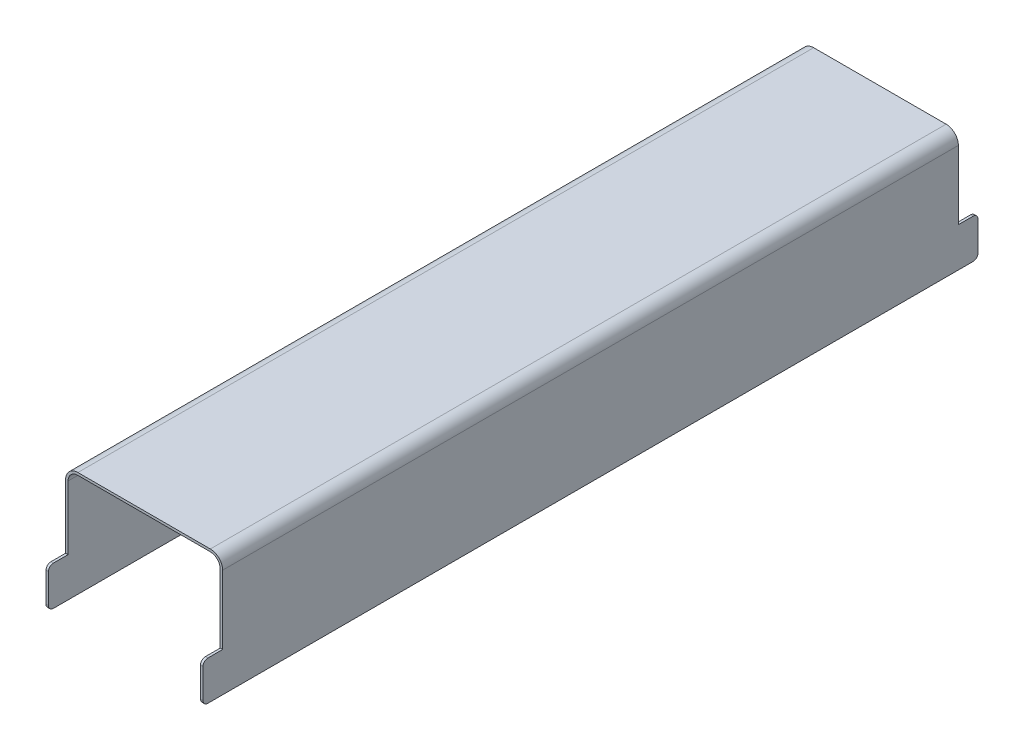
ISO-10303-21;
HEADER;
FILE_DESCRIPTION(('STEP AP214'),'2;1');
FILE_NAME('part.step','',(''),(''),'','','');
FILE_SCHEMA(('AUTOMOTIVE_DESIGN { 1 0 10303 214 1 1 1 1 }'));
ENDSEC;
DATA;
#1=APPLICATION_CONTEXT('core data for automotive mechanical design processes');
#2=APPLICATION_PROTOCOL_DEFINITION('international standard','automotive_design',2000,#1);
#3=PRODUCT_CONTEXT('',#1,'mechanical');
#4=PRODUCT('Part','Part','',(#3));
#5=PRODUCT_RELATED_PRODUCT_CATEGORY('part','',(#4));
#6=PRODUCT_DEFINITION_FORMATION('','',#4);
#7=PRODUCT_DEFINITION_CONTEXT('part definition',#1,'design');
#8=PRODUCT_DEFINITION('design','',#6,#7);
#9=PRODUCT_DEFINITION_SHAPE('','',#8);
#10=(LENGTH_UNIT() NAMED_UNIT(*) SI_UNIT(.MILLI.,.METRE.));
#11=(NAMED_UNIT(*) PLANE_ANGLE_UNIT() SI_UNIT($,.RADIAN.));
#12=(NAMED_UNIT(*) SI_UNIT($,.STERADIAN.) SOLID_ANGLE_UNIT());
#13=UNCERTAINTY_MEASURE_WITH_UNIT(LENGTH_MEASURE(1.E-05),#10,'distance_accuracy_value','');
#14=(GEOMETRIC_REPRESENTATION_CONTEXT(3) GLOBAL_UNCERTAINTY_ASSIGNED_CONTEXT((#13)) GLOBAL_UNIT_ASSIGNED_CONTEXT((#10,
#11,#12)) REPRESENTATION_CONTEXT('',''));
#15=CARTESIAN_POINT('',(0.,0.,0.));
#16=DIRECTION('',(0.,0.,1.));
#17=DIRECTION('',(1.,0.,0.));
#18=AXIS2_PLACEMENT_3D('',#15,#16,#17);
#19=CARTESIAN_POINT('',(-13.5,-2.,-75.));
#20=DIRECTION('',(0.,0.,1.));
#21=DIRECTION('',(1.,0.,0.));
#22=AXIS2_PLACEMENT_3D('',#19,#20,#21);
#23=PLANE('',#22);
#24=DIRECTION('',(-1.,0.,0.));
#25=VECTOR('',#24,1.);
#26=CARTESIAN_POINT('',(-15.5,-15.,-75.));
#27=LINE('',#26,#25);
#28=CARTESIAN_POINT('',(-15.5,-15.,-75.));
#29=VERTEX_POINT('',#28);
#30=CARTESIAN_POINT('',(-16.,-15.,-75.));
#31=VERTEX_POINT('',#30);
#32=EDGE_CURVE('E258',#29,#31,#27,.T.);
#33=ORIENTED_EDGE('',*,*,#32,.T.);
#34=DIRECTION('',(0.,-1.,0.));
#35=VECTOR('',#34,1.);
#36=CARTESIAN_POINT('',(-16.,-2.,-75.));
#37=LINE('',#36,#35);
#38=CARTESIAN_POINT('',(-16.,-2.,-75.));
#39=VERTEX_POINT('',#38);
#40=EDGE_CURVE('E408',#39,#31,#37,.T.);
#41=ORIENTED_EDGE('',*,*,#40,.F.);
#42=CARTESIAN_POINT('',(-13.5,-2.,-75.));
#43=DIRECTION('',(0.,0.,1.));
#44=DIRECTION('',(1.,0.,0.));
#45=AXIS2_PLACEMENT_3D('',#42,#43,#44);
#46=CIRCLE('',#45,2.5);
#47=CARTESIAN_POINT('',(-13.5,0.499999999999999,-75.));
#48=VERTEX_POINT('',#47);
#49=EDGE_CURVE('E411',#48,#39,#46,.T.);
#50=ORIENTED_EDGE('',*,*,#49,.F.);
#51=DIRECTION('',(-1.,0.,0.));
#52=VECTOR('',#51,1.);
#53=CARTESIAN_POINT('',(13.5,0.499999999999997,-75.));
#54=LINE('',#53,#52);
#55=CARTESIAN_POINT('',(13.5,0.499999999999997,-75.));
#56=VERTEX_POINT('',#55);
#57=EDGE_CURVE('E348',#56,#48,#54,.T.);
#58=ORIENTED_EDGE('',*,*,#57,.F.);
#59=CARTESIAN_POINT('',(13.5,-2.,-75.));
#60=DIRECTION('',(0.,0.,1.));
#61=DIRECTION('',(1.,0.,0.));
#62=AXIS2_PLACEMENT_3D('',#59,#60,#61);
#63=CIRCLE('',#62,2.5);
#64=CARTESIAN_POINT('',(16.,-2.,-75.));
#65=VERTEX_POINT('',#64);
#66=EDGE_CURVE('E346',#65,#56,#63,.T.);
#67=ORIENTED_EDGE('',*,*,#66,.F.);
#68=DIRECTION('',(0.,1.,0.));
#69=VECTOR('',#68,1.);
#70=CARTESIAN_POINT('',(16.,-24.,-75.));
#71=LINE('',#70,#69);
#72=CARTESIAN_POINT('',(16.,-16.,-75.));
#73=VERTEX_POINT('',#72);
#74=EDGE_CURVE('E334',#73,#65,#71,.T.);
#75=ORIENTED_EDGE('',*,*,#74,.F.);
#76=DIRECTION('',(-1.,0.,0.));
#77=VECTOR('',#76,1.);
#78=CARTESIAN_POINT('',(16.,-16.,-75.));
#79=LINE('',#78,#77);
#80=CARTESIAN_POINT('',(15.5,-16.,-75.));
#81=VERTEX_POINT('',#80);
#82=EDGE_CURVE('E319',#73,#81,#79,.T.);
#83=ORIENTED_EDGE('',*,*,#82,.T.);
#84=DIRECTION('',(0.,1.,0.));
#85=VECTOR('',#84,1.);
#86=CARTESIAN_POINT('',(15.5,-24.,-75.));
#87=LINE('',#86,#85);
#88=CARTESIAN_POINT('',(15.5,-2.,-75.));
#89=VERTEX_POINT('',#88);
#90=EDGE_CURVE('E323',#81,#89,#87,.T.);
#91=ORIENTED_EDGE('',*,*,#90,.T.);
#92=CARTESIAN_POINT('',(13.5,-2.,-75.));
#93=DIRECTION('',(0.,0.,1.));
#94=DIRECTION('',(1.,0.,0.));
#95=AXIS2_PLACEMENT_3D('',#92,#93,#94);
#96=CIRCLE('',#95,2.);
#97=CARTESIAN_POINT('',(13.5,0.,-75.));
#98=VERTEX_POINT('',#97);
#99=EDGE_CURVE('E347',#89,#98,#96,.T.);
#100=ORIENTED_EDGE('',*,*,#99,.T.);
#101=DIRECTION('',(-1.,0.,0.));
#102=VECTOR('',#101,1.);
#103=CARTESIAN_POINT('',(13.5,0.,-75.));
#104=LINE('',#103,#102);
#105=CARTESIAN_POINT('',(-13.5,0.,-75.));
#106=VERTEX_POINT('',#105);
#107=EDGE_CURVE('E360',#98,#106,#104,.T.);
#108=ORIENTED_EDGE('',*,*,#107,.T.);
#109=CARTESIAN_POINT('',(-13.5,-2.,-75.));
#110=DIRECTION('',(0.,0.,1.));
#111=DIRECTION('',(1.,0.,0.));
#112=AXIS2_PLACEMENT_3D('',#109,#110,#111);
#113=CIRCLE('',#112,2.);
#114=CARTESIAN_POINT('',(-15.5,-2.,-75.));
#115=VERTEX_POINT('',#114);
#116=EDGE_CURVE('E401',#106,#115,#113,.T.);
#117=ORIENTED_EDGE('',*,*,#116,.T.);
#118=DIRECTION('',(0.,-1.,0.));
#119=VECTOR('',#118,1.);
#120=CARTESIAN_POINT('',(-15.5,-2.,-75.));
#121=LINE('',#120,#119);
#122=EDGE_CURVE('E404',#115,#29,#121,.T.);
#123=ORIENTED_EDGE('',*,*,#122,.T.);
#124=EDGE_LOOP('',(#33,#41,#50,#58,#67,#75,#83,#91,#100,#108,#117,#123));
#125=FACE_BOUND('',#124,.T.);
#126=ADVANCED_FACE('F36',(#125),#23,.F.);
#127=CARTESIAN_POINT('',(-13.5,-2.,75.));
#128=DIRECTION('',(0.,0.,1.));
#129=DIRECTION('',(1.,0.,0.));
#130=AXIS2_PLACEMENT_3D('',#127,#128,#129);
#131=PLANE('',#130);
#132=DIRECTION('',(0.,-1.,0.));
#133=VECTOR('',#132,1.);
#134=CARTESIAN_POINT('',(-16.,-2.,75.));
#135=LINE('',#134,#133);
#136=CARTESIAN_POINT('',(-16.,-2.,75.));
#137=VERTEX_POINT('',#136);
#138=CARTESIAN_POINT('',(-16.,-15.,75.));
#139=VERTEX_POINT('',#138);
#140=EDGE_CURVE('E58',#137,#139,#135,.T.);
#141=ORIENTED_EDGE('',*,*,#140,.T.);
#142=DIRECTION('',(-1.,0.,0.));
#143=VECTOR('',#142,1.);
#144=CARTESIAN_POINT('',(-15.5,-15.,75.));
#145=LINE('',#144,#143);
#146=CARTESIAN_POINT('',(-15.5,-15.,75.));
#147=VERTEX_POINT('',#146);
#148=EDGE_CURVE('E53',#147,#139,#145,.T.);
#149=ORIENTED_EDGE('',*,*,#148,.F.);
#150=DIRECTION('',(0.,-1.,0.));
#151=VECTOR('',#150,1.);
#152=CARTESIAN_POINT('',(-15.5,-2.,75.));
#153=LINE('',#152,#151);
#154=CARTESIAN_POINT('',(-15.5,-2.,75.));
#155=VERTEX_POINT('',#154);
#156=EDGE_CURVE('E430',#155,#147,#153,.T.);
#157=ORIENTED_EDGE('',*,*,#156,.F.);
#158=CARTESIAN_POINT('',(-13.5,-2.,75.));
#159=DIRECTION('',(0.,0.,1.));
#160=DIRECTION('',(1.,0.,0.));
#161=AXIS2_PLACEMENT_3D('',#158,#159,#160);
#162=CIRCLE('',#161,2.);
#163=CARTESIAN_POINT('',(-13.5,0.,75.));
#164=VERTEX_POINT('',#163);
#165=EDGE_CURVE('E362',#164,#155,#162,.T.);
#166=ORIENTED_EDGE('',*,*,#165,.F.);
#167=DIRECTION('',(-1.,0.,0.));
#168=VECTOR('',#167,1.);
#169=CARTESIAN_POINT('',(13.5,0.,75.));
#170=LINE('',#169,#168);
#171=CARTESIAN_POINT('',(13.5,0.,75.));
#172=VERTEX_POINT('',#171);
#173=EDGE_CURVE('E385',#172,#164,#170,.T.);
#174=ORIENTED_EDGE('',*,*,#173,.F.);
#175=CARTESIAN_POINT('',(13.5,-2.,75.));
#176=DIRECTION('',(0.,0.,1.));
#177=DIRECTION('',(1.,0.,0.));
#178=AXIS2_PLACEMENT_3D('',#175,#176,#177);
#179=CIRCLE('',#178,2.);
#180=CARTESIAN_POINT('',(15.5,-2.,75.));
#181=VERTEX_POINT('',#180);
#182=EDGE_CURVE('E389',#181,#172,#179,.T.);
#183=ORIENTED_EDGE('',*,*,#182,.F.);
#184=DIRECTION('',(0.,1.,0.));
#185=VECTOR('',#184,1.);
#186=CARTESIAN_POINT('',(15.5,-24.,75.));
#187=LINE('',#186,#185);
#188=CARTESIAN_POINT('',(15.5,-16.,75.));
#189=VERTEX_POINT('',#188);
#190=EDGE_CURVE('E386',#189,#181,#187,.T.);
#191=ORIENTED_EDGE('',*,*,#190,.F.);
#192=DIRECTION('',(-1.,0.,0.));
#193=VECTOR('',#192,1.);
#194=CARTESIAN_POINT('',(16.,-16.,75.));
#195=LINE('',#194,#193);
#196=CARTESIAN_POINT('',(16.,-16.,75.));
#197=VERTEX_POINT('',#196);
#198=EDGE_CURVE('E405',#197,#189,#195,.T.);
#199=ORIENTED_EDGE('',*,*,#198,.F.);
#200=DIRECTION('',(0.,1.,0.));
#201=VECTOR('',#200,1.);
#202=CARTESIAN_POINT('',(16.,-24.,75.));
#203=LINE('',#202,#201);
#204=CARTESIAN_POINT('',(16.,-2.,75.));
#205=VERTEX_POINT('',#204);
#206=EDGE_CURVE('E390',#197,#205,#203,.T.);
#207=ORIENTED_EDGE('',*,*,#206,.T.);
#208=CARTESIAN_POINT('',(13.5,-2.,75.));
#209=DIRECTION('',(0.,0.,1.));
#210=DIRECTION('',(1.,0.,0.));
#211=AXIS2_PLACEMENT_3D('',#208,#209,#210);
#212=CIRCLE('',#211,2.5);
#213=CARTESIAN_POINT('',(13.5,0.499999999999997,75.));
#214=VERTEX_POINT('',#213);
#215=EDGE_CURVE('E437',#205,#214,#212,.T.);
#216=ORIENTED_EDGE('',*,*,#215,.T.);
#217=DIRECTION('',(-1.,0.,0.));
#218=VECTOR('',#217,1.);
#219=CARTESIAN_POINT('',(13.5,0.499999999999997,75.));
#220=LINE('',#219,#218);
#221=CARTESIAN_POINT('',(-13.5,0.499999999999999,75.));
#222=VERTEX_POINT('',#221);
#223=EDGE_CURVE('E432',#214,#222,#220,.T.);
#224=ORIENTED_EDGE('',*,*,#223,.T.);
#225=CARTESIAN_POINT('',(-13.5,-2.,75.));
#226=DIRECTION('',(0.,0.,1.));
#227=DIRECTION('',(1.,0.,0.));
#228=AXIS2_PLACEMENT_3D('',#225,#226,#227);
#229=CIRCLE('',#228,2.5);
#230=EDGE_CURVE('E422',#222,#137,#229,.T.);
#231=ORIENTED_EDGE('',*,*,#230,.T.);
#232=EDGE_LOOP('',(#141,#149,#157,#166,#174,#183,#191,#199,#207,#216,#224,#231));
#233=FACE_BOUND('',#232,.T.);
#234=ADVANCED_FACE('F440',(#233),#131,.T.);
#235=CARTESIAN_POINT('',(-13.5,-2.,75.));
#236=DIRECTION('',(0.,0.,-1.));
#237=DIRECTION('',(-1.,0.,0.));
#238=AXIS2_PLACEMENT_3D('',#235,#236,#237);
#239=CYLINDRICAL_SURFACE('',#238,2.);
#240=ORIENTED_EDGE('',*,*,#116,.F.);
#241=DIRECTION('',(0.,0.,-1.));
#242=VECTOR('',#241,1.);
#243=CARTESIAN_POINT('',(-13.5,0.,75.));
#244=LINE('',#243,#242);
#245=EDGE_CURVE('E11',#164,#106,#244,.T.);
#246=ORIENTED_EDGE('',*,*,#245,.F.);
#247=ORIENTED_EDGE('',*,*,#165,.T.);
#248=DIRECTION('',(0.,0.,-1.));
#249=VECTOR('',#248,1.);
#250=CARTESIAN_POINT('',(-15.5,-2.,75.));
#251=LINE('',#250,#249);
#252=EDGE_CURVE('E234',#155,#115,#251,.T.);
#253=ORIENTED_EDGE('',*,*,#252,.T.);
#254=EDGE_LOOP('',(#240,#246,#247,#253));
#255=FACE_BOUND('',#254,.T.);
#256=ADVANCED_FACE('F38',(#255),#239,.F.);
#257=CARTESIAN_POINT('',(13.5,0.,75.));
#258=DIRECTION('',(0.,-1.,0.));
#259=DIRECTION('',(0.,0.,-1.));
#260=AXIS2_PLACEMENT_3D('',#257,#258,#259);
#261=PLANE('',#260);
#262=ORIENTED_EDGE('',*,*,#107,.F.);
#263=DIRECTION('',(0.,0.,-1.));
#264=VECTOR('',#263,1.);
#265=CARTESIAN_POINT('',(13.5,0.,75.));
#266=LINE('',#265,#264);
#267=EDGE_CURVE('E45',#172,#98,#266,.T.);
#268=ORIENTED_EDGE('',*,*,#267,.F.);
#269=ORIENTED_EDGE('',*,*,#173,.T.);
#270=ORIENTED_EDGE('',*,*,#245,.T.);
#271=EDGE_LOOP('',(#262,#268,#269,#270));
#272=FACE_BOUND('',#271,.T.);
#273=ADVANCED_FACE('F462',(#272),#261,.T.);
#274=CARTESIAN_POINT('',(13.5,-2.,75.));
#275=DIRECTION('',(0.,0.,-1.));
#276=DIRECTION('',(-1.,0.,0.));
#277=AXIS2_PLACEMENT_3D('',#274,#275,#276);
#278=CYLINDRICAL_SURFACE('',#277,2.);
#279=ORIENTED_EDGE('',*,*,#99,.F.);
#280=DIRECTION('',(0.,0.,-1.));
#281=VECTOR('',#280,1.);
#282=CARTESIAN_POINT('',(15.5,-2.,75.));
#283=LINE('',#282,#281);
#284=EDGE_CURVE('E365',#181,#89,#283,.T.);
#285=ORIENTED_EDGE('',*,*,#284,.F.);
#286=ORIENTED_EDGE('',*,*,#182,.T.);
#287=ORIENTED_EDGE('',*,*,#267,.T.);
#288=EDGE_LOOP('',(#279,#285,#286,#287));
#289=FACE_BOUND('',#288,.T.);
#290=ADVANCED_FACE('F465',(#289),#278,.F.);
#291=CARTESIAN_POINT('',(15.5,-24.,75.));
#292=DIRECTION('',(-1.,0.,0.));
#293=DIRECTION('',(0.,-1.,0.));
#294=AXIS2_PLACEMENT_3D('',#291,#292,#293);
#295=PLANE('',#294);
#296=ORIENTED_EDGE('',*,*,#90,.F.);
#297=DIRECTION('',(0.,0.,1.));
#298=VECTOR('',#297,1.);
#299=CARTESIAN_POINT('',(15.5,-16.,-78.));
#300=LINE('',#299,#298);
#301=CARTESIAN_POINT('',(15.5,-16.,-78.));
#302=VERTEX_POINT('',#301);
#303=EDGE_CURVE('E304',#302,#81,#300,.T.);
#304=ORIENTED_EDGE('',*,*,#303,.F.);
#305=CARTESIAN_POINT('',(15.5,-17.,-78.));
#306=DIRECTION('',(1.,0.,0.));
#307=DIRECTION('',(0.,0.,-1.));
#308=AXIS2_PLACEMENT_3D('',#305,#306,#307);
#309=CIRCLE('',#308,0.999999999999999);
#310=CARTESIAN_POINT('',(15.5,-17.,-79.));
#311=VERTEX_POINT('',#310);
#312=EDGE_CURVE('E312',#311,#302,#309,.T.);
#313=ORIENTED_EDGE('',*,*,#312,.F.);
#314=DIRECTION('',(0.,1.,0.));
#315=VECTOR('',#314,1.);
#316=CARTESIAN_POINT('',(15.5,-23.,-79.));
#317=LINE('',#316,#315);
#318=CARTESIAN_POINT('',(15.5,-23.,-79.));
#319=VERTEX_POINT('',#318);
#320=EDGE_CURVE('E310',#319,#311,#317,.T.);
#321=ORIENTED_EDGE('',*,*,#320,.F.);
#322=CARTESIAN_POINT('',(15.5,-23.,-78.));
#323=DIRECTION('',(1.,0.,0.));
#324=DIRECTION('',(0.,0.,-1.));
#325=AXIS2_PLACEMENT_3D('',#322,#323,#324);
#326=CIRCLE('',#325,1.);
#327=CARTESIAN_POINT('',(15.5,-24.,-78.));
#328=VERTEX_POINT('',#327);
#329=EDGE_CURVE('E300',#328,#319,#326,.T.);
#330=ORIENTED_EDGE('',*,*,#329,.F.);
#331=DIRECTION('',(0.,0.,-1.));
#332=VECTOR('',#331,1.);
#333=CARTESIAN_POINT('',(15.5,-24.,75.));
#334=LINE('',#333,#332);
#335=CARTESIAN_POINT('',(15.5,-24.,78.));
#336=VERTEX_POINT('',#335);
#337=EDGE_CURVE('E368',#336,#328,#334,.T.);
#338=ORIENTED_EDGE('',*,*,#337,.F.);
#339=CARTESIAN_POINT('',(15.5,-23.,78.));
#340=DIRECTION('',(1.,0.,0.));
#341=DIRECTION('',(0.,0.,1.));
#342=AXIS2_PLACEMENT_3D('',#339,#340,#341);
#343=CIRCLE('',#342,0.999999999999999);
#344=CARTESIAN_POINT('',(15.5,-23.,79.));
#345=VERTEX_POINT('',#344);
#346=EDGE_CURVE('E519',#345,#336,#343,.T.);
#347=ORIENTED_EDGE('',*,*,#346,.F.);
#348=DIRECTION('',(0.,-1.,0.));
#349=VECTOR('',#348,1.);
#350=CARTESIAN_POINT('',(15.5,-23.,79.));
#351=LINE('',#350,#349);
#352=CARTESIAN_POINT('',(15.5,-17.,79.));
#353=VERTEX_POINT('',#352);
#354=EDGE_CURVE('E517',#353,#345,#351,.T.);
#355=ORIENTED_EDGE('',*,*,#354,.F.);
#356=CARTESIAN_POINT('',(15.5,-17.,78.));
#357=DIRECTION('',(1.,0.,0.));
#358=DIRECTION('',(0.,0.,-1.));
#359=AXIS2_PLACEMENT_3D('',#356,#357,#358);
#360=CIRCLE('',#359,1.);
#361=CARTESIAN_POINT('',(15.5,-16.,78.));
#362=VERTEX_POINT('',#361);
#363=EDGE_CURVE('E515',#362,#353,#360,.T.);
#364=ORIENTED_EDGE('',*,*,#363,.F.);
#365=DIRECTION('',(0.,0.,1.));
#366=VECTOR('',#365,1.);
#367=CARTESIAN_POINT('',(15.5,-16.,78.));
#368=LINE('',#367,#366);
#369=EDGE_CURVE('E492',#189,#362,#368,.T.);
#370=ORIENTED_EDGE('',*,*,#369,.F.);
#371=ORIENTED_EDGE('',*,*,#190,.T.);
#372=ORIENTED_EDGE('',*,*,#284,.T.);
#373=EDGE_LOOP('',(#296,#304,#313,#321,#330,#338,#347,#355,#364,#370,#371,#372));
#374=FACE_BOUND('',#373,.T.);
#375=ADVANCED_FACE('F469',(#374),#295,.T.);
#376=CARTESIAN_POINT('',(15.5,-24.,75.));
#377=DIRECTION('',(0.,1.,0.));
#378=DIRECTION('',(0.,0.,1.));
#379=AXIS2_PLACEMENT_3D('',#376,#377,#378);
#380=PLANE('',#379);
#381=ORIENTED_EDGE('',*,*,#337,.T.);
#382=DIRECTION('',(-1.,0.,0.));
#383=VECTOR('',#382,1.);
#384=CARTESIAN_POINT('',(16.,-24.,-78.));
#385=LINE('',#384,#383);
#386=CARTESIAN_POINT('',(16.,-24.,-78.));
#387=VERTEX_POINT('',#386);
#388=EDGE_CURVE('E481',#387,#328,#385,.T.);
#389=ORIENTED_EDGE('',*,*,#388,.F.);
#390=DIRECTION('',(0.,0.,-1.));
#391=VECTOR('',#390,1.);
#392=CARTESIAN_POINT('',(16.,-24.,75.));
#393=LINE('',#392,#391);
#394=CARTESIAN_POINT('',(16.,-24.,78.));
#395=VERTEX_POINT('',#394);
#396=EDGE_CURVE('E370',#395,#387,#393,.T.);
#397=ORIENTED_EDGE('',*,*,#396,.F.);
#398=DIRECTION('',(-1.,0.,0.));
#399=VECTOR('',#398,1.);
#400=CARTESIAN_POINT('',(16.,-24.,78.));
#401=LINE('',#400,#399);
#402=EDGE_CURVE('E484',#395,#336,#401,.T.);
#403=ORIENTED_EDGE('',*,*,#402,.T.);
#404=EDGE_LOOP('',(#381,#389,#397,#403));
#405=FACE_BOUND('',#404,.T.);
#406=ADVANCED_FACE('F452',(#405),#380,.F.);
#407=CARTESIAN_POINT('',(16.,-24.,75.));
#408=DIRECTION('',(-1.,0.,0.));
#409=DIRECTION('',(0.,-1.,0.));
#410=AXIS2_PLACEMENT_3D('',#407,#408,#409);
#411=PLANE('',#410);
#412=ORIENTED_EDGE('',*,*,#396,.T.);
#413=CARTESIAN_POINT('',(16.,-23.,-78.));
#414=DIRECTION('',(1.,0.,0.));
#415=DIRECTION('',(0.,0.,-1.));
#416=AXIS2_PLACEMENT_3D('',#413,#414,#415);
#417=CIRCLE('',#416,1.);
#418=CARTESIAN_POINT('',(16.,-23.,-79.));
#419=VERTEX_POINT('',#418);
#420=EDGE_CURVE('E301',#387,#419,#417,.T.);
#421=ORIENTED_EDGE('',*,*,#420,.T.);
#422=DIRECTION('',(0.,1.,0.));
#423=VECTOR('',#422,1.);
#424=CARTESIAN_POINT('',(16.,-23.,-79.));
#425=LINE('',#424,#423);
#426=CARTESIAN_POINT('',(16.,-17.,-79.));
#427=VERTEX_POINT('',#426);
#428=EDGE_CURVE('E303',#419,#427,#425,.T.);
#429=ORIENTED_EDGE('',*,*,#428,.T.);
#430=CARTESIAN_POINT('',(16.,-17.,-78.));
#431=DIRECTION('',(1.,0.,0.));
#432=DIRECTION('',(0.,0.,-1.));
#433=AXIS2_PLACEMENT_3D('',#430,#431,#432);
#434=CIRCLE('',#433,0.999999999999999);
#435=CARTESIAN_POINT('',(16.,-16.,-78.));
#436=VERTEX_POINT('',#435);
#437=EDGE_CURVE('E306',#427,#436,#434,.T.);
#438=ORIENTED_EDGE('',*,*,#437,.T.);
#439=DIRECTION('',(0.,0.,1.));
#440=VECTOR('',#439,1.);
#441=CARTESIAN_POINT('',(16.,-16.,-78.));
#442=LINE('',#441,#440);
#443=EDGE_CURVE('E308',#436,#73,#442,.T.);
#444=ORIENTED_EDGE('',*,*,#443,.T.);
#445=ORIENTED_EDGE('',*,*,#74,.T.);
#446=DIRECTION('',(0.,0.,-1.));
#447=VECTOR('',#446,1.);
#448=CARTESIAN_POINT('',(16.,-2.,75.));
#449=LINE('',#448,#447);
#450=EDGE_CURVE('E372',#205,#65,#449,.T.);
#451=ORIENTED_EDGE('',*,*,#450,.F.);
#452=ORIENTED_EDGE('',*,*,#206,.F.);
#453=DIRECTION('',(0.,0.,1.));
#454=VECTOR('',#453,1.);
#455=CARTESIAN_POINT('',(16.,-16.,78.));
#456=LINE('',#455,#454);
#457=CARTESIAN_POINT('',(16.,-16.,78.));
#458=VERTEX_POINT('',#457);
#459=EDGE_CURVE('E510',#197,#458,#456,.T.);
#460=ORIENTED_EDGE('',*,*,#459,.T.);
#461=CARTESIAN_POINT('',(16.,-17.,78.));
#462=DIRECTION('',(1.,0.,0.));
#463=DIRECTION('',(0.,0.,-1.));
#464=AXIS2_PLACEMENT_3D('',#461,#462,#463);
#465=CIRCLE('',#464,1.);
#466=CARTESIAN_POINT('',(16.,-17.,79.));
#467=VERTEX_POINT('',#466);
#468=EDGE_CURVE('E507',#458,#467,#465,.T.);
#469=ORIENTED_EDGE('',*,*,#468,.T.);
#470=DIRECTION('',(0.,-1.,0.));
#471=VECTOR('',#470,1.);
#472=CARTESIAN_POINT('',(16.,-23.,79.));
#473=LINE('',#472,#471);
#474=CARTESIAN_POINT('',(16.,-23.,79.));
#475=VERTEX_POINT('',#474);
#476=EDGE_CURVE('E509',#467,#475,#473,.T.);
#477=ORIENTED_EDGE('',*,*,#476,.T.);
#478=CARTESIAN_POINT('',(16.,-23.,78.));
#479=DIRECTION('',(1.,0.,0.));
#480=DIRECTION('',(0.,0.,1.));
#481=AXIS2_PLACEMENT_3D('',#478,#479,#480);
#482=CIRCLE('',#481,0.999999999999999);
#483=EDGE_CURVE('E512',#475,#395,#482,.T.);
#484=ORIENTED_EDGE('',*,*,#483,.T.);
#485=EDGE_LOOP('',(#412,#421,#429,#438,#444,#445,#451,#452,#460,#469,#477,#484));
#486=FACE_BOUND('',#485,.T.);
#487=ADVANCED_FACE('F331',(#486),#411,.F.);
#488=CARTESIAN_POINT('',(13.5,-2.,75.));
#489=DIRECTION('',(0.,0.,-1.));
#490=DIRECTION('',(-1.,0.,0.));
#491=AXIS2_PLACEMENT_3D('',#488,#489,#490);
#492=CYLINDRICAL_SURFACE('',#491,2.5);
#493=ORIENTED_EDGE('',*,*,#66,.T.);
#494=DIRECTION('',(0.,0.,-1.));
#495=VECTOR('',#494,1.);
#496=CARTESIAN_POINT('',(13.5,0.499999999999997,75.));
#497=LINE('',#496,#495);
#498=EDGE_CURVE('E374',#214,#56,#497,.T.);
#499=ORIENTED_EDGE('',*,*,#498,.F.);
#500=ORIENTED_EDGE('',*,*,#215,.F.);
#501=ORIENTED_EDGE('',*,*,#450,.T.);
#502=EDGE_LOOP('',(#493,#499,#500,#501));
#503=FACE_BOUND('',#502,.T.);
#504=ADVANCED_FACE('F444',(#503),#492,.T.);
#505=CARTESIAN_POINT('',(13.5,0.499999999999997,75.));
#506=DIRECTION('',(0.,-1.,0.));
#507=DIRECTION('',(1.,0.,0.));
#508=AXIS2_PLACEMENT_3D('',#505,#506,#507);
#509=PLANE('',#508);
#510=ORIENTED_EDGE('',*,*,#57,.T.);
#511=DIRECTION('',(0.,0.,-1.));
#512=VECTOR('',#511,1.);
#513=CARTESIAN_POINT('',(-13.5,0.499999999999999,75.));
#514=LINE('',#513,#512);
#515=EDGE_CURVE('E377',#222,#48,#514,.T.);
#516=ORIENTED_EDGE('',*,*,#515,.F.);
#517=ORIENTED_EDGE('',*,*,#223,.F.);
#518=ORIENTED_EDGE('',*,*,#498,.T.);
#519=EDGE_LOOP('',(#510,#516,#517,#518));
#520=FACE_BOUND('',#519,.T.);
#521=ADVANCED_FACE('F414',(#520),#509,.F.);
#522=CARTESIAN_POINT('',(-13.5,-2.,75.));
#523=DIRECTION('',(0.,0.,-1.));
#524=DIRECTION('',(-1.,0.,0.));
#525=AXIS2_PLACEMENT_3D('',#522,#523,#524);
#526=CYLINDRICAL_SURFACE('',#525,2.5);
#527=ORIENTED_EDGE('',*,*,#49,.T.);
#528=DIRECTION('',(0.,0.,-1.));
#529=VECTOR('',#528,1.);
#530=CARTESIAN_POINT('',(-16.,-2.,75.));
#531=LINE('',#530,#529);
#532=EDGE_CURVE('E380',#137,#39,#531,.T.);
#533=ORIENTED_EDGE('',*,*,#532,.F.);
#534=ORIENTED_EDGE('',*,*,#230,.F.);
#535=ORIENTED_EDGE('',*,*,#515,.T.);
#536=EDGE_LOOP('',(#527,#533,#534,#535));
#537=FACE_BOUND('',#536,.T.);
#538=ADVANCED_FACE('F420',(#537),#526,.T.);
#539=CARTESIAN_POINT('',(-16.,-2.,75.));
#540=DIRECTION('',(1.,0.,0.));
#541=DIRECTION('',(0.,1.,0.));
#542=AXIS2_PLACEMENT_3D('',#539,#540,#541);
#543=PLANE('',#542);
#544=ORIENTED_EDGE('',*,*,#40,.T.);
#545=DIRECTION('',(0.,0.,1.));
#546=VECTOR('',#545,1.);
#547=CARTESIAN_POINT('',(-16.,-15.,-78.));
#548=LINE('',#547,#546);
#549=CARTESIAN_POINT('',(-16.,-15.,-78.));
#550=VERTEX_POINT('',#549);
#551=EDGE_CURVE('E248',#550,#31,#548,.T.);
#552=ORIENTED_EDGE('',*,*,#551,.F.);
#553=CARTESIAN_POINT('',(-16.,-16.,-78.));
#554=DIRECTION('',(1.,0.,0.));
#555=DIRECTION('',(0.,0.,-1.));
#556=AXIS2_PLACEMENT_3D('',#553,#554,#555);
#557=CIRCLE('',#556,0.999999999999999);
#558=CARTESIAN_POINT('',(-16.,-16.,-79.));
#559=VERTEX_POINT('',#558);
#560=EDGE_CURVE('E252',#559,#550,#557,.T.);
#561=ORIENTED_EDGE('',*,*,#560,.F.);
#562=DIRECTION('',(0.,1.,0.));
#563=VECTOR('',#562,1.);
#564=CARTESIAN_POINT('',(-16.,-22.,-79.));
#565=LINE('',#564,#563);
#566=CARTESIAN_POINT('',(-16.,-22.,-79.));
#567=VERTEX_POINT('',#566);
#568=EDGE_CURVE('E261',#567,#559,#565,.T.);
#569=ORIENTED_EDGE('',*,*,#568,.F.);
#570=CARTESIAN_POINT('',(-16.,-22.,-78.));
#571=DIRECTION('',(1.,0.,0.));
#572=DIRECTION('',(0.,0.,1.));
#573=AXIS2_PLACEMENT_3D('',#570,#571,#572);
#574=CIRCLE('',#573,1.);
#575=CARTESIAN_POINT('',(-16.,-23.,-78.));
#576=VERTEX_POINT('',#575);
#577=EDGE_CURVE('E259',#576,#567,#574,.T.);
#578=ORIENTED_EDGE('',*,*,#577,.F.);
#579=DIRECTION('',(0.,0.,-1.));
#580=VECTOR('',#579,1.);
#581=CARTESIAN_POINT('',(-16.,-23.,75.));
#582=LINE('',#581,#580);
#583=CARTESIAN_POINT('',(-16.,-23.,78.));
#584=VERTEX_POINT('',#583);
#585=EDGE_CURVE('E233',#584,#576,#582,.T.);
#586=ORIENTED_EDGE('',*,*,#585,.F.);
#587=CARTESIAN_POINT('',(-16.,-22.,78.));
#588=DIRECTION('',(1.,0.,0.));
#589=DIRECTION('',(0.,0.,1.));
#590=AXIS2_PLACEMENT_3D('',#587,#588,#589);
#591=CIRCLE('',#590,1.);
#592=CARTESIAN_POINT('',(-16.,-22.,79.));
#593=VERTEX_POINT('',#592);
#594=EDGE_CURVE('E276',#593,#584,#591,.T.);
#595=ORIENTED_EDGE('',*,*,#594,.F.);
#596=DIRECTION('',(0.,-1.,0.));
#597=VECTOR('',#596,1.);
#598=CARTESIAN_POINT('',(-16.,-22.,79.));
#599=LINE('',#598,#597);
#600=CARTESIAN_POINT('',(-16.,-16.,79.));
#601=VERTEX_POINT('',#600);
#602=EDGE_CURVE('E285',#601,#593,#599,.T.);
#603=ORIENTED_EDGE('',*,*,#602,.F.);
#604=CARTESIAN_POINT('',(-16.,-16.,78.));
#605=DIRECTION('',(1.,0.,0.));
#606=DIRECTION('',(0.,0.,1.));
#607=AXIS2_PLACEMENT_3D('',#604,#605,#606);
#608=CIRCLE('',#607,1.);
#609=CARTESIAN_POINT('',(-16.,-15.,78.));
#610=VERTEX_POINT('',#609);
#611=EDGE_CURVE('E283',#610,#601,#608,.T.);
#612=ORIENTED_EDGE('',*,*,#611,.F.);
#613=DIRECTION('',(0.,0.,1.));
#614=VECTOR('',#613,1.);
#615=CARTESIAN_POINT('',(-16.,-15.,78.));
#616=LINE('',#615,#614);
#617=EDGE_CURVE('E241',#139,#610,#616,.T.);
#618=ORIENTED_EDGE('',*,*,#617,.F.);
#619=ORIENTED_EDGE('',*,*,#140,.F.);
#620=ORIENTED_EDGE('',*,*,#532,.T.);
#621=EDGE_LOOP('',(#544,#552,#561,#569,#578,#586,#595,#603,#612,#618,#619,#620));
#622=FACE_BOUND('',#621,.T.);
#623=ADVANCED_FACE('F427',(#622),#543,.F.);
#624=CARTESIAN_POINT('',(-16.,-23.,75.));
#625=DIRECTION('',(0.,1.,0.));
#626=DIRECTION('',(0.,0.,1.));
#627=AXIS2_PLACEMENT_3D('',#624,#625,#626);
#628=PLANE('',#627);
#629=ORIENTED_EDGE('',*,*,#585,.T.);
#630=DIRECTION('',(-1.,0.,0.));
#631=VECTOR('',#630,1.);
#632=CARTESIAN_POINT('',(-15.5,-23.,-78.));
#633=LINE('',#632,#631);
#634=CARTESIAN_POINT('',(-15.5,-23.,-78.));
#635=VERTEX_POINT('',#634);
#636=EDGE_CURVE('E237',#635,#576,#633,.T.);
#637=ORIENTED_EDGE('',*,*,#636,.F.);
#638=DIRECTION('',(0.,0.,-1.));
#639=VECTOR('',#638,1.);
#640=CARTESIAN_POINT('',(-15.5,-23.,75.));
#641=LINE('',#640,#639);
#642=CARTESIAN_POINT('',(-15.5,-23.,78.));
#643=VERTEX_POINT('',#642);
#644=EDGE_CURVE('E221',#643,#635,#641,.T.);
#645=ORIENTED_EDGE('',*,*,#644,.F.);
#646=DIRECTION('',(-1.,0.,0.));
#647=VECTOR('',#646,1.);
#648=CARTESIAN_POINT('',(-15.5,-23.,78.));
#649=LINE('',#648,#647);
#650=EDGE_CURVE('E281',#643,#584,#649,.T.);
#651=ORIENTED_EDGE('',*,*,#650,.T.);
#652=EDGE_LOOP('',(#629,#637,#645,#651));
#653=FACE_BOUND('',#652,.T.);
#654=ADVANCED_FACE('F238',(#653),#628,.F.);
#655=CARTESIAN_POINT('',(-15.5,-2.,75.));
#656=DIRECTION('',(1.,0.,0.));
#657=DIRECTION('',(0.,0.,-1.));
#658=AXIS2_PLACEMENT_3D('',#655,#656,#657);
#659=PLANE('',#658);
#660=ORIENTED_EDGE('',*,*,#122,.F.);
#661=ORIENTED_EDGE('',*,*,#252,.F.);
#662=ORIENTED_EDGE('',*,*,#156,.T.);
#663=DIRECTION('',(0.,0.,1.));
#664=VECTOR('',#663,1.);
#665=CARTESIAN_POINT('',(-15.5,-15.,78.));
#666=LINE('',#665,#664);
#667=CARTESIAN_POINT('',(-15.5,-15.,78.));
#668=VERTEX_POINT('',#667);
#669=EDGE_CURVE('E273',#147,#668,#666,.T.);
#670=ORIENTED_EDGE('',*,*,#669,.T.);
#671=CARTESIAN_POINT('',(-15.5,-16.,78.));
#672=DIRECTION('',(1.,0.,0.));
#673=DIRECTION('',(0.,0.,1.));
#674=AXIS2_PLACEMENT_3D('',#671,#672,#673);
#675=CIRCLE('',#674,1.);
#676=CARTESIAN_POINT('',(-15.5,-16.,79.));
#677=VERTEX_POINT('',#676);
#678=EDGE_CURVE('E275',#668,#677,#675,.T.);
#679=ORIENTED_EDGE('',*,*,#678,.T.);
#680=DIRECTION('',(0.,-1.,0.));
#681=VECTOR('',#680,1.);
#682=CARTESIAN_POINT('',(-15.5,-22.,79.));
#683=LINE('',#682,#681);
#684=CARTESIAN_POINT('',(-15.5,-22.,79.));
#685=VERTEX_POINT('',#684);
#686=EDGE_CURVE('E278',#677,#685,#683,.T.);
#687=ORIENTED_EDGE('',*,*,#686,.T.);
#688=CARTESIAN_POINT('',(-15.5,-22.,78.));
#689=DIRECTION('',(1.,0.,0.));
#690=DIRECTION('',(0.,0.,1.));
#691=AXIS2_PLACEMENT_3D('',#688,#689,#690);
#692=CIRCLE('',#691,1.);
#693=EDGE_CURVE('E229',#685,#643,#692,.T.);
#694=ORIENTED_EDGE('',*,*,#693,.T.);
#695=ORIENTED_EDGE('',*,*,#644,.T.);
#696=CARTESIAN_POINT('',(-15.5,-22.,-78.));
#697=DIRECTION('',(1.,0.,0.));
#698=DIRECTION('',(0.,0.,1.));
#699=AXIS2_PLACEMENT_3D('',#696,#697,#698);
#700=CIRCLE('',#699,1.);
#701=CARTESIAN_POINT('',(-15.5,-22.,-79.));
#702=VERTEX_POINT('',#701);
#703=EDGE_CURVE('E226',#635,#702,#700,.T.);
#704=ORIENTED_EDGE('',*,*,#703,.T.);
#705=DIRECTION('',(0.,1.,0.));
#706=VECTOR('',#705,1.);
#707=CARTESIAN_POINT('',(-15.5,-22.,-79.));
#708=LINE('',#707,#706);
#709=CARTESIAN_POINT('',(-15.5,-16.,-79.));
#710=VERTEX_POINT('',#709);
#711=EDGE_CURVE('E247',#702,#710,#708,.T.);
#712=ORIENTED_EDGE('',*,*,#711,.T.);
#713=CARTESIAN_POINT('',(-15.5,-16.,-78.));
#714=DIRECTION('',(1.,0.,0.));
#715=DIRECTION('',(0.,0.,-1.));
#716=AXIS2_PLACEMENT_3D('',#713,#714,#715);
#717=CIRCLE('',#716,0.999999999999999);
#718=CARTESIAN_POINT('',(-15.5,-15.,-78.));
#719=VERTEX_POINT('',#718);
#720=EDGE_CURVE('E250',#710,#719,#717,.T.);
#721=ORIENTED_EDGE('',*,*,#720,.T.);
#722=DIRECTION('',(0.,0.,1.));
#723=VECTOR('',#722,1.);
#724=CARTESIAN_POINT('',(-15.5,-15.,-78.));
#725=LINE('',#724,#723);
#726=EDGE_CURVE('E256',#719,#29,#725,.T.);
#727=ORIENTED_EDGE('',*,*,#726,.T.);
#728=EDGE_LOOP('',(#660,#661,#662,#670,#679,#687,#694,#695,#704,#712,#721,#727));
#729=FACE_BOUND('',#728,.T.);
#730=ADVANCED_FACE('F224',(#729),#659,.T.);
#731=CARTESIAN_POINT('',(16.,-16.,78.));
#732=DIRECTION('',(0.,-1.,0.));
#733=DIRECTION('',(0.,0.,-1.));
#734=AXIS2_PLACEMENT_3D('',#731,#732,#733);
#735=PLANE('',#734);
#736=ORIENTED_EDGE('',*,*,#369,.T.);
#737=DIRECTION('',(-1.,0.,0.));
#738=VECTOR('',#737,1.);
#739=CARTESIAN_POINT('',(16.,-16.,78.));
#740=LINE('',#739,#738);
#741=EDGE_CURVE('E528',#458,#362,#740,.T.);
#742=ORIENTED_EDGE('',*,*,#741,.F.);
#743=ORIENTED_EDGE('',*,*,#459,.F.);
#744=ORIENTED_EDGE('',*,*,#198,.T.);
#745=EDGE_LOOP('',(#736,#742,#743,#744));
#746=FACE_BOUND('',#745,.T.);
#747=ADVANCED_FACE('F539',(#746),#735,.F.);
#748=CARTESIAN_POINT('',(16.,-17.,78.));
#749=DIRECTION('',(-1.,0.,0.));
#750=DIRECTION('',(0.,0.,1.));
#751=AXIS2_PLACEMENT_3D('',#748,#749,#750);
#752=CYLINDRICAL_SURFACE('',#751,1.);
#753=ORIENTED_EDGE('',*,*,#363,.T.);
#754=DIRECTION('',(-1.,0.,0.));
#755=VECTOR('',#754,1.);
#756=CARTESIAN_POINT('',(16.,-17.,79.));
#757=LINE('',#756,#755);
#758=EDGE_CURVE('E525',#467,#353,#757,.T.);
#759=ORIENTED_EDGE('',*,*,#758,.F.);
#760=ORIENTED_EDGE('',*,*,#468,.F.);
#761=ORIENTED_EDGE('',*,*,#741,.T.);
#762=EDGE_LOOP('',(#753,#759,#760,#761));
#763=FACE_BOUND('',#762,.T.);
#764=ADVANCED_FACE('F543',(#763),#752,.T.);
#765=CARTESIAN_POINT('',(16.,-23.,79.));
#766=DIRECTION('',(0.,0.,-1.));
#767=DIRECTION('',(-1.,0.,0.));
#768=AXIS2_PLACEMENT_3D('',#765,#766,#767);
#769=PLANE('',#768);
#770=ORIENTED_EDGE('',*,*,#354,.T.);
#771=DIRECTION('',(-1.,0.,0.));
#772=VECTOR('',#771,1.);
#773=CARTESIAN_POINT('',(16.,-23.,79.));
#774=LINE('',#773,#772);
#775=EDGE_CURVE('E522',#475,#345,#774,.T.);
#776=ORIENTED_EDGE('',*,*,#775,.F.);
#777=ORIENTED_EDGE('',*,*,#476,.F.);
#778=ORIENTED_EDGE('',*,*,#758,.T.);
#779=EDGE_LOOP('',(#770,#776,#777,#778));
#780=FACE_BOUND('',#779,.T.);
#781=ADVANCED_FACE('F548',(#780),#769,.F.);
#782=CARTESIAN_POINT('',(16.,-23.,78.));
#783=DIRECTION('',(-1.,0.,0.));
#784=DIRECTION('',(0.,0.,1.));
#785=AXIS2_PLACEMENT_3D('',#782,#783,#784);
#786=CYLINDRICAL_SURFACE('',#785,0.999999999999999);
#787=ORIENTED_EDGE('',*,*,#346,.T.);
#788=ORIENTED_EDGE('',*,*,#402,.F.);
#789=ORIENTED_EDGE('',*,*,#483,.F.);
#790=ORIENTED_EDGE('',*,*,#775,.T.);
#791=EDGE_LOOP('',(#787,#788,#789,#790));
#792=FACE_BOUND('',#791,.T.);
#793=ADVANCED_FACE('F551',(#792),#786,.T.);
#794=CARTESIAN_POINT('',(16.,-23.,-78.));
#795=DIRECTION('',(-1.,0.,0.));
#796=DIRECTION('',(0.,0.,1.));
#797=AXIS2_PLACEMENT_3D('',#794,#795,#796);
#798=CYLINDRICAL_SURFACE('',#797,1.);
#799=ORIENTED_EDGE('',*,*,#329,.T.);
#800=DIRECTION('',(-1.,0.,0.));
#801=VECTOR('',#800,1.);
#802=CARTESIAN_POINT('',(16.,-23.,-79.));
#803=LINE('',#802,#801);
#804=EDGE_CURVE('E493',#419,#319,#803,.T.);
#805=ORIENTED_EDGE('',*,*,#804,.F.);
#806=ORIENTED_EDGE('',*,*,#420,.F.);
#807=ORIENTED_EDGE('',*,*,#388,.T.);
#808=EDGE_LOOP('',(#799,#805,#806,#807));
#809=FACE_BOUND('',#808,.T.);
#810=ADVANCED_FACE('F489',(#809),#798,.T.);
#811=CARTESIAN_POINT('',(16.,-23.,-79.));
#812=DIRECTION('',(0.,0.,1.));
#813=DIRECTION('',(1.,0.,0.));
#814=AXIS2_PLACEMENT_3D('',#811,#812,#813);
#815=PLANE('',#814);
#816=ORIENTED_EDGE('',*,*,#320,.T.);
#817=DIRECTION('',(-1.,0.,0.));
#818=VECTOR('',#817,1.);
#819=CARTESIAN_POINT('',(16.,-17.,-79.));
#820=LINE('',#819,#818);
#821=EDGE_CURVE('E502',#427,#311,#820,.T.);
#822=ORIENTED_EDGE('',*,*,#821,.F.);
#823=ORIENTED_EDGE('',*,*,#428,.F.);
#824=ORIENTED_EDGE('',*,*,#804,.T.);
#825=EDGE_LOOP('',(#816,#822,#823,#824));
#826=FACE_BOUND('',#825,.T.);
#827=ADVANCED_FACE('F500',(#826),#815,.F.);
#828=CARTESIAN_POINT('',(16.,-17.,-78.));
#829=DIRECTION('',(-1.,0.,0.));
#830=DIRECTION('',(0.,0.,1.));
#831=AXIS2_PLACEMENT_3D('',#828,#829,#830);
#832=CYLINDRICAL_SURFACE('',#831,0.999999999999999);
#833=ORIENTED_EDGE('',*,*,#312,.T.);
#834=DIRECTION('',(-1.,0.,0.));
#835=VECTOR('',#834,1.);
#836=CARTESIAN_POINT('',(16.,-16.,-78.));
#837=LINE('',#836,#835);
#838=EDGE_CURVE('E316',#436,#302,#837,.T.);
#839=ORIENTED_EDGE('',*,*,#838,.F.);
#840=ORIENTED_EDGE('',*,*,#437,.F.);
#841=ORIENTED_EDGE('',*,*,#821,.T.);
#842=EDGE_LOOP('',(#833,#839,#840,#841));
#843=FACE_BOUND('',#842,.T.);
#844=ADVANCED_FACE('F504',(#843),#832,.T.);
#845=CARTESIAN_POINT('',(16.,-16.,-78.));
#846=DIRECTION('',(0.,-1.,0.));
#847=DIRECTION('',(0.,0.,-1.));
#848=AXIS2_PLACEMENT_3D('',#845,#846,#847);
#849=PLANE('',#848);
#850=ORIENTED_EDGE('',*,*,#303,.T.);
#851=ORIENTED_EDGE('',*,*,#82,.F.);
#852=ORIENTED_EDGE('',*,*,#443,.F.);
#853=ORIENTED_EDGE('',*,*,#838,.T.);
#854=EDGE_LOOP('',(#850,#851,#852,#853));
#855=FACE_BOUND('',#854,.T.);
#856=ADVANCED_FACE('F340',(#855),#849,.F.);
#857=CARTESIAN_POINT('',(-15.5,-15.,78.));
#858=DIRECTION('',(0.,-1.,0.));
#859=DIRECTION('',(0.,0.,-1.));
#860=AXIS2_PLACEMENT_3D('',#857,#858,#859);
#861=PLANE('',#860);
#862=ORIENTED_EDGE('',*,*,#617,.T.);
#863=DIRECTION('',(-1.,0.,0.));
#864=VECTOR('',#863,1.);
#865=CARTESIAN_POINT('',(-15.5,-15.,78.));
#866=LINE('',#865,#864);
#867=EDGE_CURVE('E296',#668,#610,#866,.T.);
#868=ORIENTED_EDGE('',*,*,#867,.F.);
#869=ORIENTED_EDGE('',*,*,#669,.F.);
#870=ORIENTED_EDGE('',*,*,#148,.T.);
#871=EDGE_LOOP('',(#862,#868,#869,#870));
#872=FACE_BOUND('',#871,.T.);
#873=ADVANCED_FACE('F593',(#872),#861,.F.);
#874=CARTESIAN_POINT('',(-15.5,-16.,78.));
#875=DIRECTION('',(-1.,0.,0.));
#876=DIRECTION('',(0.,0.,1.));
#877=AXIS2_PLACEMENT_3D('',#874,#875,#876);
#878=CYLINDRICAL_SURFACE('',#877,1.);
#879=ORIENTED_EDGE('',*,*,#611,.T.);
#880=DIRECTION('',(-1.,0.,0.));
#881=VECTOR('',#880,1.);
#882=CARTESIAN_POINT('',(-15.5,-16.,79.));
#883=LINE('',#882,#881);
#884=EDGE_CURVE('E293',#677,#601,#883,.T.);
#885=ORIENTED_EDGE('',*,*,#884,.F.);
#886=ORIENTED_EDGE('',*,*,#678,.F.);
#887=ORIENTED_EDGE('',*,*,#867,.T.);
#888=EDGE_LOOP('',(#879,#885,#886,#887));
#889=FACE_BOUND('',#888,.T.);
#890=ADVANCED_FACE('F589',(#889),#878,.T.);
#891=CARTESIAN_POINT('',(-15.5,-22.,79.));
#892=DIRECTION('',(0.,0.,-1.));
#893=DIRECTION('',(-1.,0.,0.));
#894=AXIS2_PLACEMENT_3D('',#891,#892,#893);
#895=PLANE('',#894);
#896=ORIENTED_EDGE('',*,*,#602,.T.);
#897=DIRECTION('',(-1.,0.,0.));
#898=VECTOR('',#897,1.);
#899=CARTESIAN_POINT('',(-15.5,-22.,79.));
#900=LINE('',#899,#898);
#901=EDGE_CURVE('E290',#685,#593,#900,.T.);
#902=ORIENTED_EDGE('',*,*,#901,.F.);
#903=ORIENTED_EDGE('',*,*,#686,.F.);
#904=ORIENTED_EDGE('',*,*,#884,.T.);
#905=EDGE_LOOP('',(#896,#902,#903,#904));
#906=FACE_BOUND('',#905,.T.);
#907=ADVANCED_FACE('F585',(#906),#895,.F.);
#908=CARTESIAN_POINT('',(-15.5,-22.,78.));
#909=DIRECTION('',(-1.,0.,0.));
#910=DIRECTION('',(0.,0.,1.));
#911=AXIS2_PLACEMENT_3D('',#908,#909,#910);
#912=CYLINDRICAL_SURFACE('',#911,1.);
#913=ORIENTED_EDGE('',*,*,#594,.T.);
#914=ORIENTED_EDGE('',*,*,#650,.F.);
#915=ORIENTED_EDGE('',*,*,#693,.F.);
#916=ORIENTED_EDGE('',*,*,#901,.T.);
#917=EDGE_LOOP('',(#913,#914,#915,#916));
#918=FACE_BOUND('',#917,.T.);
#919=ADVANCED_FACE('F579',(#918),#912,.T.);
#920=CARTESIAN_POINT('',(-15.5,-22.,-78.));
#921=DIRECTION('',(-1.,0.,0.));
#922=DIRECTION('',(0.,0.,1.));
#923=AXIS2_PLACEMENT_3D('',#920,#921,#922);
#924=CYLINDRICAL_SURFACE('',#923,1.);
#925=ORIENTED_EDGE('',*,*,#577,.T.);
#926=DIRECTION('',(-1.,0.,0.));
#927=VECTOR('',#926,1.);
#928=CARTESIAN_POINT('',(-15.5,-22.,-79.));
#929=LINE('',#928,#927);
#930=EDGE_CURVE('E242',#702,#567,#929,.T.);
#931=ORIENTED_EDGE('',*,*,#930,.F.);
#932=ORIENTED_EDGE('',*,*,#703,.F.);
#933=ORIENTED_EDGE('',*,*,#636,.T.);
#934=EDGE_LOOP('',(#925,#931,#932,#933));
#935=FACE_BOUND('',#934,.T.);
#936=ADVANCED_FACE('F244',(#935),#924,.T.);
#937=CARTESIAN_POINT('',(-15.5,-22.,-79.));
#938=DIRECTION('',(0.,0.,1.));
#939=DIRECTION('',(1.,0.,0.));
#940=AXIS2_PLACEMENT_3D('',#937,#938,#939);
#941=PLANE('',#940);
#942=ORIENTED_EDGE('',*,*,#568,.T.);
#943=DIRECTION('',(-1.,0.,0.));
#944=VECTOR('',#943,1.);
#945=CARTESIAN_POINT('',(-15.5,-16.,-79.));
#946=LINE('',#945,#944);
#947=EDGE_CURVE('E269',#710,#559,#946,.T.);
#948=ORIENTED_EDGE('',*,*,#947,.F.);
#949=ORIENTED_EDGE('',*,*,#711,.F.);
#950=ORIENTED_EDGE('',*,*,#930,.T.);
#951=EDGE_LOOP('',(#942,#948,#949,#950));
#952=FACE_BOUND('',#951,.T.);
#953=ADVANCED_FACE('F571',(#952),#941,.F.);
#954=CARTESIAN_POINT('',(-15.5,-16.,-78.));
#955=DIRECTION('',(-1.,0.,0.));
#956=DIRECTION('',(0.,0.,1.));
#957=AXIS2_PLACEMENT_3D('',#954,#955,#956);
#958=CYLINDRICAL_SURFACE('',#957,0.999999999999999);
#959=ORIENTED_EDGE('',*,*,#560,.T.);
#960=DIRECTION('',(-1.,0.,0.));
#961=VECTOR('',#960,1.);
#962=CARTESIAN_POINT('',(-15.5,-15.,-78.));
#963=LINE('',#962,#961);
#964=EDGE_CURVE('E266',#719,#550,#963,.T.);
#965=ORIENTED_EDGE('',*,*,#964,.F.);
#966=ORIENTED_EDGE('',*,*,#720,.F.);
#967=ORIENTED_EDGE('',*,*,#947,.T.);
#968=EDGE_LOOP('',(#959,#965,#966,#967));
#969=FACE_BOUND('',#968,.T.);
#970=ADVANCED_FACE('F567',(#969),#958,.T.);
#971=CARTESIAN_POINT('',(-15.5,-15.,-78.));
#972=DIRECTION('',(0.,-1.,0.));
#973=DIRECTION('',(0.,0.,-1.));
#974=AXIS2_PLACEMENT_3D('',#971,#972,#973);
#975=PLANE('',#974);
#976=ORIENTED_EDGE('',*,*,#551,.T.);
#977=ORIENTED_EDGE('',*,*,#32,.F.);
#978=ORIENTED_EDGE('',*,*,#726,.F.);
#979=ORIENTED_EDGE('',*,*,#964,.T.);
#980=EDGE_LOOP('',(#976,#977,#978,#979));
#981=FACE_BOUND('',#980,.T.);
#982=ADVANCED_FACE('F565',(#981),#975,.F.);
#983=CLOSED_SHELL('',(#126,#234,#256,#273,#290,#375,#406,#487,#504,#521,#538,#623,#654,#730,
#747,#764,#781,#793,#810,#827,#844,#856,#873,#890,#907,#919,#936,#953,#970,#982));
#984=MANIFOLD_SOLID_BREP('B2',#983);
#985=ADVANCED_BREP_SHAPE_REPRESENTATION('',(#18,#984),#14);
#986=SHAPE_DEFINITION_REPRESENTATION(#9,#985);
ENDSEC;
END-ISO-10303-21;
